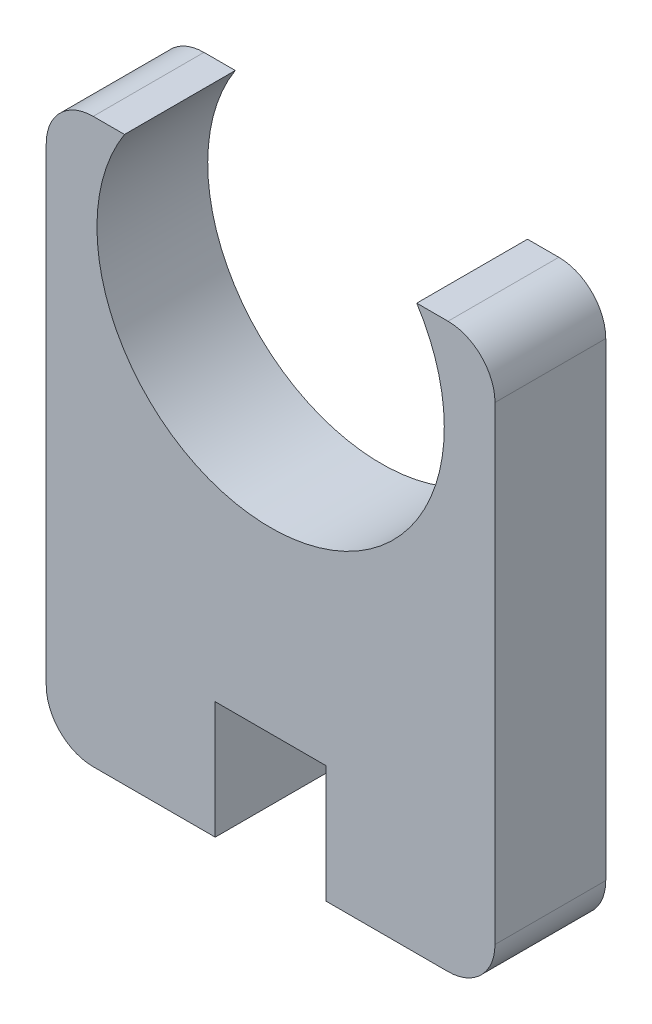
ISO-10303-21;
HEADER;
FILE_DESCRIPTION(('STEP AP214'),'2;1');
FILE_NAME('part.step','',(''),(''),'','','');
FILE_SCHEMA(('AUTOMOTIVE_DESIGN { 1 0 10303 214 1 1 1 1 }'));
ENDSEC;
DATA;
#1=APPLICATION_CONTEXT('core data for automotive mechanical design processes');
#2=APPLICATION_PROTOCOL_DEFINITION('international standard','automotive_design',2000,#1);
#3=PRODUCT_CONTEXT('',#1,'mechanical');
#4=PRODUCT('Part','Part','',(#3));
#5=PRODUCT_RELATED_PRODUCT_CATEGORY('part','',(#4));
#6=PRODUCT_DEFINITION_FORMATION('','',#4);
#7=PRODUCT_DEFINITION_CONTEXT('part definition',#1,'design');
#8=PRODUCT_DEFINITION('design','',#6,#7);
#9=PRODUCT_DEFINITION_SHAPE('','',#8);
#10=(LENGTH_UNIT() NAMED_UNIT(*) SI_UNIT(.MILLI.,.METRE.));
#11=(NAMED_UNIT(*) PLANE_ANGLE_UNIT() SI_UNIT($,.RADIAN.));
#12=(NAMED_UNIT(*) SI_UNIT($,.STERADIAN.) SOLID_ANGLE_UNIT());
#13=UNCERTAINTY_MEASURE_WITH_UNIT(LENGTH_MEASURE(1.E-05),#10,'distance_accuracy_value','');
#14=(GEOMETRIC_REPRESENTATION_CONTEXT(3) GLOBAL_UNCERTAINTY_ASSIGNED_CONTEXT((#13)) GLOBAL_UNIT_ASSIGNED_CONTEXT((#10,
#11,#12)) REPRESENTATION_CONTEXT('',''));
#15=CARTESIAN_POINT('',(0.,0.,0.));
#16=DIRECTION('',(0.,0.,1.));
#17=DIRECTION('',(1.,0.,0.));
#18=AXIS2_PLACEMENT_3D('',#15,#16,#17);
#19=CARTESIAN_POINT('',(4.572,0.,2.9972));
#20=DIRECTION('',(0.,1.,0.));
#21=DIRECTION('',(-1.,0.,0.));
#22=AXIS2_PLACEMENT_3D('',#19,#20,#21);
#23=PLANE('',#22);
#24=DIRECTION('',(1.,0.,0.));
#25=VECTOR('',#24,1.);
#26=CARTESIAN_POINT('',(4.572,0.,2.9972));
#27=LINE('',#26,#25);
#28=CARTESIAN_POINT('',(1.27,0.,2.9972));
#29=VERTEX_POINT('',#28);
#30=CARTESIAN_POINT('',(4.572,0.,2.9972));
#31=VERTEX_POINT('',#30);
#32=EDGE_CURVE('E133',#29,#31,#27,.T.);
#33=ORIENTED_EDGE('',*,*,#32,.F.);
#34=DIRECTION('',(0.,0.,-1.));
#35=VECTOR('',#34,1.);
#36=CARTESIAN_POINT('',(1.27,0.,2.9972));
#37=LINE('',#36,#35);
#38=CARTESIAN_POINT('',(1.27,0.,0.));
#39=VERTEX_POINT('',#38);
#40=EDGE_CURVE('E185',#29,#39,#37,.T.);
#41=ORIENTED_EDGE('',*,*,#40,.T.);
#42=DIRECTION('',(1.,0.,0.));
#43=VECTOR('',#42,1.);
#44=CARTESIAN_POINT('',(4.572,0.,0.));
#45=LINE('',#44,#43);
#46=CARTESIAN_POINT('',(4.572,0.,0.));
#47=VERTEX_POINT('',#46);
#48=EDGE_CURVE('E157',#39,#47,#45,.T.);
#49=ORIENTED_EDGE('',*,*,#48,.T.);
#50=DIRECTION('',(0.,0.,-1.));
#51=VECTOR('',#50,1.);
#52=CARTESIAN_POINT('',(4.572,0.,2.9972));
#53=LINE('',#52,#51);
#54=EDGE_CURVE('E150',#31,#47,#53,.T.);
#55=ORIENTED_EDGE('',*,*,#54,.F.);
#56=EDGE_LOOP('',(#33,#41,#49,#55));
#57=FACE_BOUND('',#56,.T.);
#58=ADVANCED_FACE('F33',(#57),#23,.F.);
#59=CARTESIAN_POINT('',(4.572,3.175,2.9972));
#60=DIRECTION('',(-1.,0.,0.));
#61=DIRECTION('',(0.,0.,1.));
#62=AXIS2_PLACEMENT_3D('',#59,#60,#61);
#63=PLANE('',#62);
#64=DIRECTION('',(0.,1.,0.));
#65=VECTOR('',#64,1.);
#66=CARTESIAN_POINT('',(4.572,3.175,0.));
#67=LINE('',#66,#65);
#68=CARTESIAN_POINT('',(4.572,3.175,0.));
#69=VERTEX_POINT('',#68);
#70=EDGE_CURVE('E243',#47,#69,#67,.T.);
#71=ORIENTED_EDGE('',*,*,#70,.T.);
#72=DIRECTION('',(0.,0.,-1.));
#73=VECTOR('',#72,1.);
#74=CARTESIAN_POINT('',(4.572,3.175,2.9972));
#75=LINE('',#74,#73);
#76=CARTESIAN_POINT('',(4.572,3.175,2.9972));
#77=VERTEX_POINT('',#76);
#78=EDGE_CURVE('E152',#77,#69,#75,.T.);
#79=ORIENTED_EDGE('',*,*,#78,.F.);
#80=DIRECTION('',(0.,1.,0.));
#81=VECTOR('',#80,1.);
#82=CARTESIAN_POINT('',(4.572,3.175,2.9972));
#83=LINE('',#82,#81);
#84=EDGE_CURVE('E137',#31,#77,#83,.T.);
#85=ORIENTED_EDGE('',*,*,#84,.F.);
#86=ORIENTED_EDGE('',*,*,#54,.T.);
#87=EDGE_LOOP('',(#71,#79,#85,#86));
#88=FACE_BOUND('',#87,.T.);
#89=ADVANCED_FACE('F149',(#88),#63,.F.);
#90=CARTESIAN_POINT('',(7.5692,3.175,2.9972));
#91=DIRECTION('',(0.,1.,0.));
#92=DIRECTION('',(-1.,0.,0.));
#93=AXIS2_PLACEMENT_3D('',#90,#91,#92);
#94=PLANE('',#93);
#95=DIRECTION('',(1.,0.,0.));
#96=VECTOR('',#95,1.);
#97=CARTESIAN_POINT('',(7.5692,3.175,0.));
#98=LINE('',#97,#96);
#99=CARTESIAN_POINT('',(7.5692,3.175,0.));
#100=VERTEX_POINT('',#99);
#101=EDGE_CURVE('E240',#69,#100,#98,.T.);
#102=ORIENTED_EDGE('',*,*,#101,.T.);
#103=DIRECTION('',(0.,0.,-1.));
#104=VECTOR('',#103,1.);
#105=CARTESIAN_POINT('',(7.5692,3.175,2.9972));
#106=LINE('',#105,#104);
#107=CARTESIAN_POINT('',(7.5692,3.175,2.9972));
#108=VERTEX_POINT('',#107);
#109=EDGE_CURVE('E163',#108,#100,#106,.T.);
#110=ORIENTED_EDGE('',*,*,#109,.F.);
#111=DIRECTION('',(1.,0.,0.));
#112=VECTOR('',#111,1.);
#113=CARTESIAN_POINT('',(7.5692,3.175,2.9972));
#114=LINE('',#113,#112);
#115=EDGE_CURVE('E154',#77,#108,#114,.T.);
#116=ORIENTED_EDGE('',*,*,#115,.F.);
#117=ORIENTED_EDGE('',*,*,#78,.T.);
#118=EDGE_LOOP('',(#102,#110,#116,#117));
#119=FACE_BOUND('',#118,.T.);
#120=ADVANCED_FACE('F260',(#119),#94,.F.);
#121=CARTESIAN_POINT('',(7.5692,0.,2.9972));
#122=DIRECTION('',(1.,0.,0.));
#123=DIRECTION('',(0.,0.,-1.));
#124=AXIS2_PLACEMENT_3D('',#121,#122,#123);
#125=PLANE('',#124);
#126=DIRECTION('',(0.,-1.,0.));
#127=VECTOR('',#126,1.);
#128=CARTESIAN_POINT('',(7.5692,0.,0.));
#129=LINE('',#128,#127);
#130=CARTESIAN_POINT('',(7.5692,0.,0.));
#131=VERTEX_POINT('',#130);
#132=EDGE_CURVE('E235',#100,#131,#129,.T.);
#133=ORIENTED_EDGE('',*,*,#132,.T.);
#134=DIRECTION('',(0.,0.,-1.));
#135=VECTOR('',#134,1.);
#136=CARTESIAN_POINT('',(7.5692,0.,2.9972));
#137=LINE('',#136,#135);
#138=CARTESIAN_POINT('',(7.5692,0.,2.9972));
#139=VERTEX_POINT('',#138);
#140=EDGE_CURVE('E226',#139,#131,#137,.T.);
#141=ORIENTED_EDGE('',*,*,#140,.F.);
#142=DIRECTION('',(0.,-1.,0.));
#143=VECTOR('',#142,1.);
#144=CARTESIAN_POINT('',(7.5692,0.,2.9972));
#145=LINE('',#144,#143);
#146=EDGE_CURVE('E236',#108,#139,#145,.T.);
#147=ORIENTED_EDGE('',*,*,#146,.F.);
#148=ORIENTED_EDGE('',*,*,#109,.T.);
#149=EDGE_LOOP('',(#133,#141,#147,#148));
#150=FACE_BOUND('',#149,.T.);
#151=ADVANCED_FACE('F233',(#150),#125,.F.);
#152=CARTESIAN_POINT('',(12.1412,0.,2.9972));
#153=DIRECTION('',(0.,1.,0.));
#154=DIRECTION('',(-1.,0.,0.));
#155=AXIS2_PLACEMENT_3D('',#152,#153,#154);
#156=PLANE('',#155);
#157=DIRECTION('',(1.,0.,0.));
#158=VECTOR('',#157,1.);
#159=CARTESIAN_POINT('',(12.1412,0.,0.));
#160=LINE('',#159,#158);
#161=CARTESIAN_POINT('',(10.8712,0.,0.));
#162=VERTEX_POINT('',#161);
#163=EDGE_CURVE('E213',#131,#162,#160,.T.);
#164=ORIENTED_EDGE('',*,*,#163,.T.);
#165=DIRECTION('',(0.,0.,-1.));
#166=VECTOR('',#165,1.);
#167=CARTESIAN_POINT('',(10.8712,0.,2.9972));
#168=LINE('',#167,#166);
#169=CARTESIAN_POINT('',(10.8712,0.,2.9972));
#170=VERTEX_POINT('',#169);
#171=EDGE_CURVE('E177',#162,#170,#168,.F.);
#172=ORIENTED_EDGE('',*,*,#171,.T.);
#173=DIRECTION('',(1.,0.,0.));
#174=VECTOR('',#173,1.);
#175=CARTESIAN_POINT('',(12.1412,0.,2.9972));
#176=LINE('',#175,#174);
#177=EDGE_CURVE('E257',#139,#170,#176,.T.);
#178=ORIENTED_EDGE('',*,*,#177,.F.);
#179=ORIENTED_EDGE('',*,*,#140,.T.);
#180=EDGE_LOOP('',(#164,#172,#178,#179));
#181=FACE_BOUND('',#180,.T.);
#182=ADVANCED_FACE('F267',(#181),#156,.F.);
#183=CARTESIAN_POINT('',(12.1412,15.24,2.9972));
#184=DIRECTION('',(-1.,0.,0.));
#185=DIRECTION('',(0.,-1.,0.));
#186=AXIS2_PLACEMENT_3D('',#183,#184,#185);
#187=PLANE('',#186);
#188=DIRECTION('',(0.,1.,0.));
#189=VECTOR('',#188,1.);
#190=CARTESIAN_POINT('',(12.1412,15.24,2.9972));
#191=LINE('',#190,#189);
#192=CARTESIAN_POINT('',(12.1412,1.27,2.9972));
#193=VERTEX_POINT('',#192);
#194=CARTESIAN_POINT('',(12.1412,13.97,2.9972));
#195=VERTEX_POINT('',#194);
#196=EDGE_CURVE('E254',#193,#195,#191,.T.);
#197=ORIENTED_EDGE('',*,*,#196,.F.);
#198=DIRECTION('',(0.,0.,-1.));
#199=VECTOR('',#198,1.);
#200=CARTESIAN_POINT('',(12.1412,1.27,2.9972));
#201=LINE('',#200,#199);
#202=CARTESIAN_POINT('',(12.1412,1.27,0.));
#203=VERTEX_POINT('',#202);
#204=EDGE_CURVE('E161',#193,#203,#201,.T.);
#205=ORIENTED_EDGE('',*,*,#204,.T.);
#206=DIRECTION('',(0.,1.,0.));
#207=VECTOR('',#206,1.);
#208=CARTESIAN_POINT('',(12.1412,15.24,0.));
#209=LINE('',#208,#207);
#210=CARTESIAN_POINT('',(12.1412,13.97,0.));
#211=VERTEX_POINT('',#210);
#212=EDGE_CURVE('E209',#203,#211,#209,.T.);
#213=ORIENTED_EDGE('',*,*,#212,.T.);
#214=DIRECTION('',(0.,0.,-1.));
#215=VECTOR('',#214,1.);
#216=CARTESIAN_POINT('',(12.1412,13.97,2.9972));
#217=LINE('',#216,#215);
#218=EDGE_CURVE('E159',#211,#195,#217,.F.);
#219=ORIENTED_EDGE('',*,*,#218,.T.);
#220=EDGE_LOOP('',(#197,#205,#213,#219));
#221=FACE_BOUND('',#220,.T.);
#222=ADVANCED_FACE('F293',(#221),#187,.F.);
#223=CARTESIAN_POINT('',(10.0239531337334,15.24,2.9972));
#224=DIRECTION('',(0.,-1.,0.));
#225=DIRECTION('',(1.,0.,0.));
#226=AXIS2_PLACEMENT_3D('',#223,#224,#225);
#227=PLANE('',#226);
#228=DIRECTION('',(-1.,0.,0.));
#229=VECTOR('',#228,1.);
#230=CARTESIAN_POINT('',(10.0239531337334,15.24,2.9972));
#231=LINE('',#230,#229);
#232=CARTESIAN_POINT('',(10.8712,15.24,2.9972));
#233=VERTEX_POINT('',#232);
#234=CARTESIAN_POINT('',(10.0239531337334,15.24,2.9972));
#235=VERTEX_POINT('',#234);
#236=EDGE_CURVE('E199',#233,#235,#231,.T.);
#237=ORIENTED_EDGE('',*,*,#236,.F.);
#238=DIRECTION('',(0.,0.,-1.));
#239=VECTOR('',#238,1.);
#240=CARTESIAN_POINT('',(10.8712,15.24,2.9972));
#241=LINE('',#240,#239);
#242=CARTESIAN_POINT('',(10.8712,15.24,0.));
#243=VERTEX_POINT('',#242);
#244=EDGE_CURVE('E41',#233,#243,#241,.T.);
#245=ORIENTED_EDGE('',*,*,#244,.T.);
#246=DIRECTION('',(-1.,0.,0.));
#247=VECTOR('',#246,1.);
#248=CARTESIAN_POINT('',(10.0239531337334,15.24,0.));
#249=LINE('',#248,#247);
#250=CARTESIAN_POINT('',(10.0239531337334,15.24,0.));
#251=VERTEX_POINT('',#250);
#252=EDGE_CURVE('E197',#243,#251,#249,.T.);
#253=ORIENTED_EDGE('',*,*,#252,.T.);
#254=DIRECTION('',(0.,0.,-1.));
#255=VECTOR('',#254,1.);
#256=CARTESIAN_POINT('',(10.0239531337334,15.24,2.9972));
#257=LINE('',#256,#255);
#258=EDGE_CURVE('E223',#235,#251,#257,.T.);
#259=ORIENTED_EDGE('',*,*,#258,.F.);
#260=EDGE_LOOP('',(#237,#245,#253,#259));
#261=FACE_BOUND('',#260,.T.);
#262=ADVANCED_FACE('F195',(#261),#227,.F.);
#263=CARTESIAN_POINT('',(6.0706,12.7,2.9972));
#264=DIRECTION('',(0.,0.,-1.));
#265=DIRECTION('',(-1.,0.,0.));
#266=AXIS2_PLACEMENT_3D('',#263,#264,#265);
#267=CYLINDRICAL_SURFACE('',#266,4.699);
#268=CARTESIAN_POINT('',(6.0706,12.7,0.));
#269=DIRECTION('',(0.,0.,-1.));
#270=DIRECTION('',(1.,0.,0.));
#271=AXIS2_PLACEMENT_3D('',#268,#269,#270);
#272=CIRCLE('',#271,4.699);
#273=CARTESIAN_POINT('',(2.11724686626656,15.24,0.));
#274=VERTEX_POINT('',#273);
#275=EDGE_CURVE('E208',#251,#274,#272,.T.);
#276=ORIENTED_EDGE('',*,*,#275,.T.);
#277=DIRECTION('',(0.,0.,-1.));
#278=VECTOR('',#277,1.);
#279=CARTESIAN_POINT('',(2.11724686626656,15.24,2.9972));
#280=LINE('',#279,#278);
#281=CARTESIAN_POINT('',(2.11724686626656,15.24,2.9972));
#282=VERTEX_POINT('',#281);
#283=EDGE_CURVE('E220',#282,#274,#280,.T.);
#284=ORIENTED_EDGE('',*,*,#283,.F.);
#285=CARTESIAN_POINT('',(6.0706,12.7,2.9972));
#286=DIRECTION('',(0.,0.,-1.));
#287=DIRECTION('',(1.,0.,0.));
#288=AXIS2_PLACEMENT_3D('',#285,#286,#287);
#289=CIRCLE('',#288,4.699);
#290=EDGE_CURVE('E251',#235,#282,#289,.T.);
#291=ORIENTED_EDGE('',*,*,#290,.F.);
#292=ORIENTED_EDGE('',*,*,#258,.T.);
#293=EDGE_LOOP('',(#276,#284,#291,#292));
#294=FACE_BOUND('',#293,.T.);
#295=ADVANCED_FACE('F306',(#294),#267,.F.);
#296=CARTESIAN_POINT('',(0.,15.24,2.9972));
#297=DIRECTION('',(0.,-1.,0.));
#298=DIRECTION('',(1.,0.,0.));
#299=AXIS2_PLACEMENT_3D('',#296,#297,#298);
#300=PLANE('',#299);
#301=DIRECTION('',(-1.,0.,0.));
#302=VECTOR('',#301,1.);
#303=CARTESIAN_POINT('',(0.,15.24,0.));
#304=LINE('',#303,#302);
#305=CARTESIAN_POINT('',(1.27,15.24,0.));
#306=VERTEX_POINT('',#305);
#307=EDGE_CURVE('E211',#274,#306,#304,.T.);
#308=ORIENTED_EDGE('',*,*,#307,.T.);
#309=DIRECTION('',(0.,0.,-1.));
#310=VECTOR('',#309,1.);
#311=CARTESIAN_POINT('',(1.27,15.24,2.9972));
#312=LINE('',#311,#310);
#313=CARTESIAN_POINT('',(1.27,15.24,2.9972));
#314=VERTEX_POINT('',#313);
#315=EDGE_CURVE('E11',#306,#314,#312,.F.);
#316=ORIENTED_EDGE('',*,*,#315,.T.);
#317=DIRECTION('',(-1.,0.,0.));
#318=VECTOR('',#317,1.);
#319=CARTESIAN_POINT('',(0.,15.24,2.9972));
#320=LINE('',#319,#318);
#321=EDGE_CURVE('E249',#282,#314,#320,.T.);
#322=ORIENTED_EDGE('',*,*,#321,.F.);
#323=ORIENTED_EDGE('',*,*,#283,.T.);
#324=EDGE_LOOP('',(#308,#316,#322,#323));
#325=FACE_BOUND('',#324,.T.);
#326=ADVANCED_FACE('F309',(#325),#300,.F.);
#327=CARTESIAN_POINT('',(0.,0.,2.9972));
#328=DIRECTION('',(1.,0.,0.));
#329=DIRECTION('',(0.,0.,-1.));
#330=AXIS2_PLACEMENT_3D('',#327,#328,#329);
#331=PLANE('',#330);
#332=DIRECTION('',(0.,-1.,0.));
#333=VECTOR('',#332,1.);
#334=CARTESIAN_POINT('',(0.,0.,0.));
#335=LINE('',#334,#333);
#336=CARTESIAN_POINT('',(0.,13.97,0.));
#337=VERTEX_POINT('',#336);
#338=CARTESIAN_POINT('',(0.,1.27,0.));
#339=VERTEX_POINT('',#338);
#340=EDGE_CURVE('E145',#337,#339,#335,.T.);
#341=ORIENTED_EDGE('',*,*,#340,.T.);
#342=DIRECTION('',(0.,0.,-1.));
#343=VECTOR('',#342,1.);
#344=CARTESIAN_POINT('',(0.,1.27,2.9972));
#345=LINE('',#344,#343);
#346=CARTESIAN_POINT('',(0.,1.27,2.9972));
#347=VERTEX_POINT('',#346);
#348=EDGE_CURVE('E48',#339,#347,#345,.F.);
#349=ORIENTED_EDGE('',*,*,#348,.T.);
#350=DIRECTION('',(0.,-1.,0.));
#351=VECTOR('',#350,1.);
#352=CARTESIAN_POINT('',(0.,0.,2.9972));
#353=LINE('',#352,#351);
#354=CARTESIAN_POINT('',(0.,13.97,2.9972));
#355=VERTEX_POINT('',#354);
#356=EDGE_CURVE('E224',#355,#347,#353,.T.);
#357=ORIENTED_EDGE('',*,*,#356,.F.);
#358=DIRECTION('',(0.,0.,-1.));
#359=VECTOR('',#358,1.);
#360=CARTESIAN_POINT('',(0.,13.97,2.9972));
#361=LINE('',#360,#359);
#362=EDGE_CURVE('E187',#355,#337,#361,.T.);
#363=ORIENTED_EDGE('',*,*,#362,.T.);
#364=EDGE_LOOP('',(#341,#349,#357,#363));
#365=FACE_BOUND('',#364,.T.);
#366=ADVANCED_FACE('F313',(#365),#331,.F.);
#367=CARTESIAN_POINT('',(6.0706,12.7,2.9972));
#368=DIRECTION('',(0.,0.,1.));
#369=DIRECTION('',(1.,0.,0.));
#370=AXIS2_PLACEMENT_3D('',#367,#368,#369);
#371=PLANE('',#370);
#372=ORIENTED_EDGE('',*,*,#177,.T.);
#373=CARTESIAN_POINT('',(10.8712,1.27,2.9972));
#374=DIRECTION('',(0.,0.,1.));
#375=DIRECTION('',(1.,0.,0.));
#376=AXIS2_PLACEMENT_3D('',#373,#374,#375);
#377=CIRCLE('',#376,1.27);
#378=EDGE_CURVE('E183',#170,#193,#377,.T.);
#379=ORIENTED_EDGE('',*,*,#378,.T.);
#380=ORIENTED_EDGE('',*,*,#196,.T.);
#381=CARTESIAN_POINT('',(10.8712,13.97,2.9972));
#382=DIRECTION('',(0.,0.,1.));
#383=DIRECTION('',(1.,0.,0.));
#384=AXIS2_PLACEMENT_3D('',#381,#382,#383);
#385=CIRCLE('',#384,1.27);
#386=EDGE_CURVE('E180',#195,#233,#385,.T.);
#387=ORIENTED_EDGE('',*,*,#386,.T.);
#388=ORIENTED_EDGE('',*,*,#236,.T.);
#389=ORIENTED_EDGE('',*,*,#290,.T.);
#390=ORIENTED_EDGE('',*,*,#321,.T.);
#391=CARTESIAN_POINT('',(1.27,13.97,2.9972));
#392=DIRECTION('',(0.,0.,1.));
#393=DIRECTION('',(1.,0.,0.));
#394=AXIS2_PLACEMENT_3D('',#391,#392,#393);
#395=CIRCLE('',#394,1.27);
#396=EDGE_CURVE('E55',#314,#355,#395,.T.);
#397=ORIENTED_EDGE('',*,*,#396,.T.);
#398=ORIENTED_EDGE('',*,*,#356,.T.);
#399=CARTESIAN_POINT('',(1.27,1.27,2.9972));
#400=DIRECTION('',(0.,0.,1.));
#401=DIRECTION('',(1.,0.,0.));
#402=AXIS2_PLACEMENT_3D('',#399,#400,#401);
#403=CIRCLE('',#402,1.27);
#404=EDGE_CURVE('E140',#347,#29,#403,.T.);
#405=ORIENTED_EDGE('',*,*,#404,.T.);
#406=ORIENTED_EDGE('',*,*,#32,.T.);
#407=ORIENTED_EDGE('',*,*,#84,.T.);
#408=ORIENTED_EDGE('',*,*,#115,.T.);
#409=ORIENTED_EDGE('',*,*,#146,.T.);
#410=EDGE_LOOP('',(#372,#379,#380,#387,#388,#389,#390,#397,#398,#405,#406,#407,#408,#409));
#411=FACE_BOUND('',#410,.T.);
#412=ADVANCED_FACE('F136',(#411),#371,.T.);
#413=CARTESIAN_POINT('',(6.0706,12.7,0.));
#414=DIRECTION('',(0.,0.,1.));
#415=DIRECTION('',(1.,0.,0.));
#416=AXIS2_PLACEMENT_3D('',#413,#414,#415);
#417=PLANE('',#416);
#418=ORIENTED_EDGE('',*,*,#212,.F.);
#419=CARTESIAN_POINT('',(10.8712,1.27,0.));
#420=DIRECTION('',(0.,0.,1.));
#421=DIRECTION('',(1.,0.,0.));
#422=AXIS2_PLACEMENT_3D('',#419,#420,#421);
#423=CIRCLE('',#422,1.27);
#424=EDGE_CURVE('E175',#203,#162,#423,.F.);
#425=ORIENTED_EDGE('',*,*,#424,.T.);
#426=ORIENTED_EDGE('',*,*,#163,.F.);
#427=ORIENTED_EDGE('',*,*,#132,.F.);
#428=ORIENTED_EDGE('',*,*,#101,.F.);
#429=ORIENTED_EDGE('',*,*,#70,.F.);
#430=ORIENTED_EDGE('',*,*,#48,.F.);
#431=CARTESIAN_POINT('',(1.27,1.27,0.));
#432=DIRECTION('',(0.,0.,1.));
#433=DIRECTION('',(1.,0.,0.));
#434=AXIS2_PLACEMENT_3D('',#431,#432,#433);
#435=CIRCLE('',#434,1.27);
#436=EDGE_CURVE('E173',#39,#339,#435,.F.);
#437=ORIENTED_EDGE('',*,*,#436,.T.);
#438=ORIENTED_EDGE('',*,*,#340,.F.);
#439=CARTESIAN_POINT('',(1.27,13.97,0.));
#440=DIRECTION('',(0.,0.,1.));
#441=DIRECTION('',(1.,0.,0.));
#442=AXIS2_PLACEMENT_3D('',#439,#440,#441);
#443=CIRCLE('',#442,1.27);
#444=EDGE_CURVE('E169',#337,#306,#443,.F.);
#445=ORIENTED_EDGE('',*,*,#444,.T.);
#446=ORIENTED_EDGE('',*,*,#307,.F.);
#447=ORIENTED_EDGE('',*,*,#275,.F.);
#448=ORIENTED_EDGE('',*,*,#252,.F.);
#449=CARTESIAN_POINT('',(10.8712,13.97,0.));
#450=DIRECTION('',(0.,0.,1.));
#451=DIRECTION('',(1.,0.,0.));
#452=AXIS2_PLACEMENT_3D('',#449,#450,#451);
#453=CIRCLE('',#452,1.27);
#454=EDGE_CURVE('E171',#243,#211,#453,.F.);
#455=ORIENTED_EDGE('',*,*,#454,.T.);
#456=EDGE_LOOP('',(#418,#425,#426,#427,#428,#429,#430,#437,#438,#445,#446,#447,#448,#455));
#457=FACE_BOUND('',#456,.T.);
#458=ADVANCED_FACE('F205',(#457),#417,.F.);
#459=CARTESIAN_POINT('',(10.8712,1.27,2.9972));
#460=DIRECTION('',(0.,0.,-1.));
#461=DIRECTION('',(-1.,0.,0.));
#462=AXIS2_PLACEMENT_3D('',#459,#460,#461);
#463=CYLINDRICAL_SURFACE('',#462,1.27);
#464=ORIENTED_EDGE('',*,*,#378,.F.);
#465=ORIENTED_EDGE('',*,*,#171,.F.);
#466=ORIENTED_EDGE('',*,*,#424,.F.);
#467=ORIENTED_EDGE('',*,*,#204,.F.);
#468=EDGE_LOOP('',(#464,#465,#466,#467));
#469=FACE_BOUND('',#468,.T.);
#470=ADVANCED_FACE('F275',(#469),#463,.T.);
#471=CARTESIAN_POINT('',(1.27,1.27,2.9972));
#472=DIRECTION('',(0.,0.,-1.));
#473=DIRECTION('',(-1.,0.,0.));
#474=AXIS2_PLACEMENT_3D('',#471,#472,#473);
#475=CYLINDRICAL_SURFACE('',#474,1.27);
#476=ORIENTED_EDGE('',*,*,#404,.F.);
#477=ORIENTED_EDGE('',*,*,#348,.F.);
#478=ORIENTED_EDGE('',*,*,#436,.F.);
#479=ORIENTED_EDGE('',*,*,#40,.F.);
#480=EDGE_LOOP('',(#476,#477,#478,#479));
#481=FACE_BOUND('',#480,.T.);
#482=ADVANCED_FACE('F278',(#481),#475,.T.);
#483=CARTESIAN_POINT('',(10.8712,13.97,2.9972));
#484=DIRECTION('',(0.,0.,-1.));
#485=DIRECTION('',(-1.,0.,0.));
#486=AXIS2_PLACEMENT_3D('',#483,#484,#485);
#487=CYLINDRICAL_SURFACE('',#486,1.27);
#488=ORIENTED_EDGE('',*,*,#386,.F.);
#489=ORIENTED_EDGE('',*,*,#218,.F.);
#490=ORIENTED_EDGE('',*,*,#454,.F.);
#491=ORIENTED_EDGE('',*,*,#244,.F.);
#492=EDGE_LOOP('',(#488,#489,#490,#491));
#493=FACE_BOUND('',#492,.T.);
#494=ADVANCED_FACE('F281',(#493),#487,.T.);
#495=CARTESIAN_POINT('',(1.27,13.97,2.9972));
#496=DIRECTION('',(0.,0.,-1.));
#497=DIRECTION('',(-1.,0.,0.));
#498=AXIS2_PLACEMENT_3D('',#495,#496,#497);
#499=CYLINDRICAL_SURFACE('',#498,1.27);
#500=ORIENTED_EDGE('',*,*,#396,.F.);
#501=ORIENTED_EDGE('',*,*,#315,.F.);
#502=ORIENTED_EDGE('',*,*,#444,.F.);
#503=ORIENTED_EDGE('',*,*,#362,.F.);
#504=EDGE_LOOP('',(#500,#501,#502,#503));
#505=FACE_BOUND('',#504,.T.);
#506=ADVANCED_FACE('F35',(#505),#499,.T.);
#507=CLOSED_SHELL('',(#58,#89,#120,#151,#182,#222,#262,#295,#326,#366,#412,#458,#470,#482,#494,#506));
#508=MANIFOLD_SOLID_BREP('B2',#507);
#509=ADVANCED_BREP_SHAPE_REPRESENTATION('',(#18,#508),#14);
#510=SHAPE_DEFINITION_REPRESENTATION(#9,#509);
ENDSEC;
END-ISO-10303-21;
